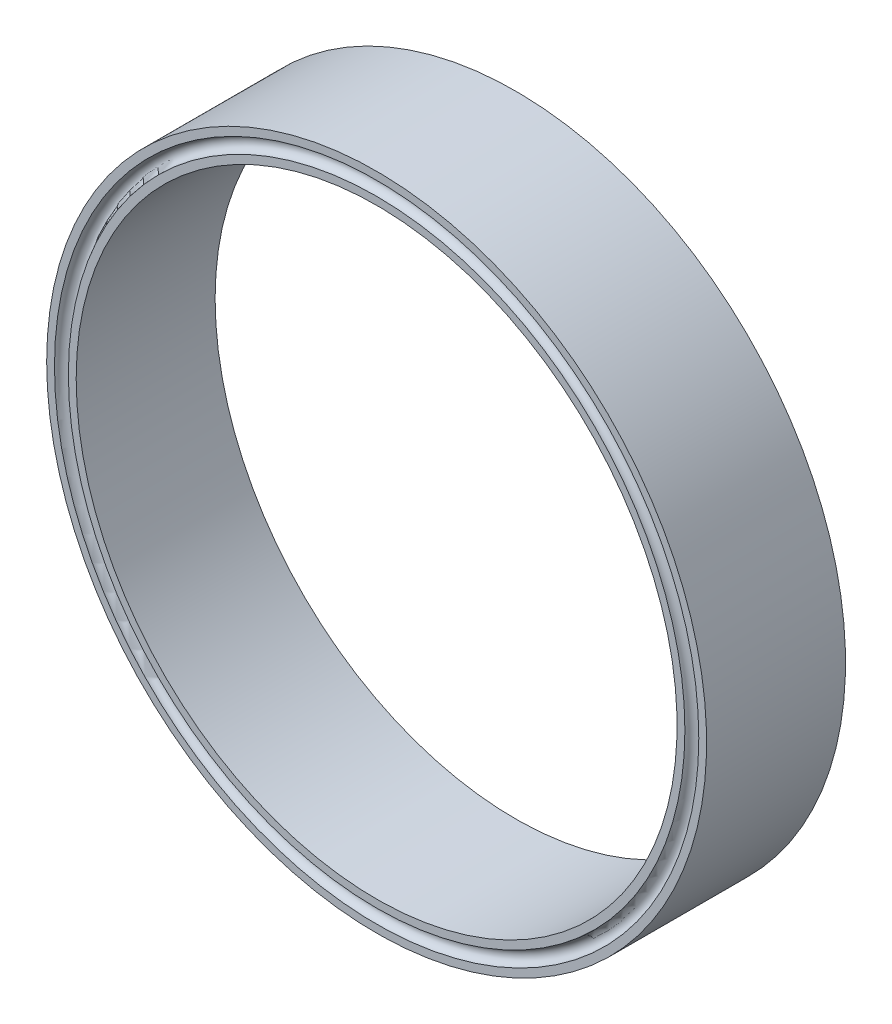
ISO-10303-21;
HEADER;
FILE_DESCRIPTION(('STEP AP214'),'2;1');
FILE_NAME('part.step','',(''),(''),'','','');
FILE_SCHEMA(('AUTOMOTIVE_DESIGN { 1 0 10303 214 1 1 1 1 }'));
ENDSEC;
DATA;
#1=APPLICATION_CONTEXT('core data for automotive mechanical design processes');
#2=APPLICATION_PROTOCOL_DEFINITION('international standard','automotive_design',2000,#1);
#3=PRODUCT_CONTEXT('',#1,'mechanical');
#4=PRODUCT('Part','Part','',(#3));
#5=PRODUCT_RELATED_PRODUCT_CATEGORY('part','',(#4));
#6=PRODUCT_DEFINITION_FORMATION('','',#4);
#7=PRODUCT_DEFINITION_CONTEXT('part definition',#1,'design');
#8=PRODUCT_DEFINITION('design','',#6,#7);
#9=PRODUCT_DEFINITION_SHAPE('','',#8);
#10=(LENGTH_UNIT() NAMED_UNIT(*) SI_UNIT(.MILLI.,.METRE.));
#11=(NAMED_UNIT(*) PLANE_ANGLE_UNIT() SI_UNIT($,.RADIAN.));
#12=(NAMED_UNIT(*) SI_UNIT($,.STERADIAN.) SOLID_ANGLE_UNIT());
#13=UNCERTAINTY_MEASURE_WITH_UNIT(LENGTH_MEASURE(1.E-05),#10,'distance_accuracy_value','');
#14=(GEOMETRIC_REPRESENTATION_CONTEXT(3) GLOBAL_UNCERTAINTY_ASSIGNED_CONTEXT((#13)) GLOBAL_UNIT_ASSIGNED_CONTEXT((#10,
#11,#12)) REPRESENTATION_CONTEXT('',''));
#15=CARTESIAN_POINT('',(0.,0.,0.));
#16=DIRECTION('',(0.,0.,1.));
#17=DIRECTION('',(1.,0.,0.));
#18=AXIS2_PLACEMENT_3D('',#15,#16,#17);
#19=CARTESIAN_POINT('',(-23.75,0.,10.));
#20=DIRECTION('',(0.,0.,-1.));
#21=DIRECTION('',(-1.,0.,0.));
#22=AXIS2_PLACEMENT_3D('',#19,#20,#21);
#23=TOROIDAL_SURFACE('',#22,45.375,1.);
#24=CARTESIAN_POINT('',(-23.75,0.,10.));
#25=DIRECTION('',(0.,0.,-1.));
#26=DIRECTION('',(-1.,0.,0.));
#27=AXIS2_PLACEMENT_3D('',#24,#25,#26);
#28=CIRCLE('',#27,44.375);
#29=CARTESIAN_POINT('',(-68.125,0.,10.));
#30=VERTEX_POINT('',#29);
#31=EDGE_CURVE('E80',#30,#30,#28,.T.);
#32=ORIENTED_EDGE('',*,*,#31,.T.);
#33=EDGE_LOOP('',(#32));
#34=FACE_BOUND('',#33,.T.);
#35=CARTESIAN_POINT('',(-23.75,0.,10.));
#36=DIRECTION('',(0.,0.,-1.));
#37=DIRECTION('',(-1.,0.,0.));
#38=AXIS2_PLACEMENT_3D('',#35,#36,#37);
#39=CIRCLE('',#38,46.375);
#40=CARTESIAN_POINT('',(-70.125,0.,10.));
#41=VERTEX_POINT('',#40);
#42=EDGE_CURVE('E10',#41,#41,#39,.T.);
#43=ORIENTED_EDGE('',*,*,#42,.F.);
#44=EDGE_LOOP('',(#43));
#45=FACE_BOUND('',#44,.T.);
#46=ADVANCED_FACE('F45',(#34,#45),#23,.F.);
#47=CARTESIAN_POINT('',(0.,0.,10.));
#48=DIRECTION('',(0.,0.,-1.));
#49=DIRECTION('',(-1.,0.,0.));
#50=AXIS2_PLACEMENT_3D('',#47,#48,#49);
#51=PLANE('',#50);
#52=CARTESIAN_POINT('',(-23.75,0.,10.));
#53=DIRECTION('',(0.,0.,-1.));
#54=DIRECTION('',(-1.,0.,0.));
#55=AXIS2_PLACEMENT_3D('',#52,#53,#54);
#56=CIRCLE('',#55,47.5);
#57=CARTESIAN_POINT('',(-71.25,0.,10.));
#58=VERTEX_POINT('',#57);
#59=EDGE_CURVE('E52',#58,#58,#56,.T.);
#60=ORIENTED_EDGE('',*,*,#59,.F.);
#61=EDGE_LOOP('',(#60));
#62=FACE_BOUND('',#61,.T.);
#63=ORIENTED_EDGE('',*,*,#42,.T.);
#64=EDGE_LOOP('',(#63));
#65=FACE_BOUND('',#64,.T.);
#66=ADVANCED_FACE('F92',(#62,#65),#51,.F.);
#67=CARTESIAN_POINT('',(-23.75,0.,-10.));
#68=DIRECTION('',(0.,0.,-1.));
#69=DIRECTION('',(-1.,0.,0.));
#70=AXIS2_PLACEMENT_3D('',#67,#68,#69);
#71=CYLINDRICAL_SURFACE('',#70,47.5);
#72=ORIENTED_EDGE('',*,*,#59,.T.);
#73=EDGE_LOOP('',(#72));
#74=FACE_BOUND('',#73,.T.);
#75=CARTESIAN_POINT('',(-23.75,0.,-10.));
#76=DIRECTION('',(0.,0.,-1.));
#77=DIRECTION('',(-1.,0.,0.));
#78=AXIS2_PLACEMENT_3D('',#75,#76,#77);
#79=CIRCLE('',#78,47.5);
#80=CARTESIAN_POINT('',(-71.25,0.,-10.));
#81=VERTEX_POINT('',#80);
#82=EDGE_CURVE('E57',#81,#81,#79,.T.);
#83=ORIENTED_EDGE('',*,*,#82,.F.);
#84=EDGE_LOOP('',(#83));
#85=FACE_BOUND('',#84,.T.);
#86=ADVANCED_FACE('F114',(#74,#85),#71,.T.);
#87=CARTESIAN_POINT('',(0.,0.,-10.));
#88=DIRECTION('',(0.,0.,1.));
#89=DIRECTION('',(1.,0.,0.));
#90=AXIS2_PLACEMENT_3D('',#87,#88,#89);
#91=PLANE('',#90);
#92=CARTESIAN_POINT('',(-23.75,0.,-10.));
#93=DIRECTION('',(0.,0.,-1.));
#94=DIRECTION('',(-1.,0.,0.));
#95=AXIS2_PLACEMENT_3D('',#92,#93,#94);
#96=CIRCLE('',#95,46.375);
#97=CARTESIAN_POINT('',(-70.125,0.,-10.));
#98=VERTEX_POINT('',#97);
#99=EDGE_CURVE('E62',#98,#98,#96,.T.);
#100=ORIENTED_EDGE('',*,*,#99,.F.);
#101=EDGE_LOOP('',(#100));
#102=FACE_BOUND('',#101,.T.);
#103=ORIENTED_EDGE('',*,*,#82,.T.);
#104=EDGE_LOOP('',(#103));
#105=FACE_BOUND('',#104,.T.);
#106=ADVANCED_FACE('F105',(#102,#105),#91,.F.);
#107=CARTESIAN_POINT('',(-23.75,0.,-10.));
#108=DIRECTION('',(0.,0.,-1.));
#109=DIRECTION('',(-1.,0.,0.));
#110=AXIS2_PLACEMENT_3D('',#107,#108,#109);
#111=TOROIDAL_SURFACE('',#110,45.375,1.);
#112=ORIENTED_EDGE('',*,*,#99,.T.);
#113=EDGE_LOOP('',(#112));
#114=FACE_BOUND('',#113,.T.);
#115=CARTESIAN_POINT('',(-23.75,0.,-10.));
#116=DIRECTION('',(0.,0.,-1.));
#117=DIRECTION('',(-1.,0.,0.));
#118=AXIS2_PLACEMENT_3D('',#115,#116,#117);
#119=CIRCLE('',#118,44.375);
#120=CARTESIAN_POINT('',(-68.125,0.,-10.));
#121=VERTEX_POINT('',#120);
#122=EDGE_CURVE('E68',#121,#121,#119,.T.);
#123=ORIENTED_EDGE('',*,*,#122,.F.);
#124=EDGE_LOOP('',(#123));
#125=FACE_BOUND('',#124,.T.);
#126=ADVANCED_FACE('F103',(#114,#125),#111,.F.);
#127=CARTESIAN_POINT('',(-23.75,0.,-10.));
#128=DIRECTION('',(0.,0.,-1.));
#129=DIRECTION('',(-1.,0.,0.));
#130=AXIS2_PLACEMENT_3D('',#127,#128,#129);
#131=CIRCLE('',#130,43.25);
#132=CARTESIAN_POINT('',(-67.,0.,-10.));
#133=VERTEX_POINT('',#132);
#134=EDGE_CURVE('E72',#133,#133,#131,.T.);
#135=ORIENTED_EDGE('',*,*,#134,.F.);
#136=EDGE_LOOP('',(#135));
#137=FACE_BOUND('',#136,.T.);
#138=ORIENTED_EDGE('',*,*,#122,.T.);
#139=EDGE_LOOP('',(#138));
#140=FACE_BOUND('',#139,.T.);
#141=ADVANCED_FACE('F97',(#137,#140),#91,.F.);
#142=CARTESIAN_POINT('',(-23.75,0.,-10.));
#143=DIRECTION('',(0.,0.,-1.));
#144=DIRECTION('',(-1.,0.,0.));
#145=AXIS2_PLACEMENT_3D('',#142,#143,#144);
#146=CYLINDRICAL_SURFACE('',#145,43.25);
#147=CARTESIAN_POINT('',(-23.75,0.,10.));
#148=DIRECTION('',(0.,0.,-1.));
#149=DIRECTION('',(-1.,0.,0.));
#150=AXIS2_PLACEMENT_3D('',#147,#148,#149);
#151=CIRCLE('',#150,43.25);
#152=CARTESIAN_POINT('',(-67.,0.,10.));
#153=VERTEX_POINT('',#152);
#154=EDGE_CURVE('E76',#153,#153,#151,.T.);
#155=ORIENTED_EDGE('',*,*,#154,.F.);
#156=EDGE_LOOP('',(#155));
#157=FACE_BOUND('',#156,.T.);
#158=ORIENTED_EDGE('',*,*,#134,.T.);
#159=EDGE_LOOP('',(#158));
#160=FACE_BOUND('',#159,.T.);
#161=ADVANCED_FACE('F90',(#157,#160),#146,.F.);
#162=ORIENTED_EDGE('',*,*,#31,.F.);
#163=EDGE_LOOP('',(#162));
#164=FACE_BOUND('',#163,.T.);
#165=ORIENTED_EDGE('',*,*,#154,.T.);
#166=EDGE_LOOP('',(#165));
#167=FACE_BOUND('',#166,.T.);
#168=ADVANCED_FACE('F87',(#164,#167),#51,.F.);
#169=CLOSED_SHELL('',(#46,#66,#86,#106,#126,#141,#161,#168));
#170=MANIFOLD_SOLID_BREP('B2',#169);
#171=ADVANCED_BREP_SHAPE_REPRESENTATION('',(#18,#170),#14);
#172=SHAPE_DEFINITION_REPRESENTATION(#9,#171);
ENDSEC;
END-ISO-10303-21;
